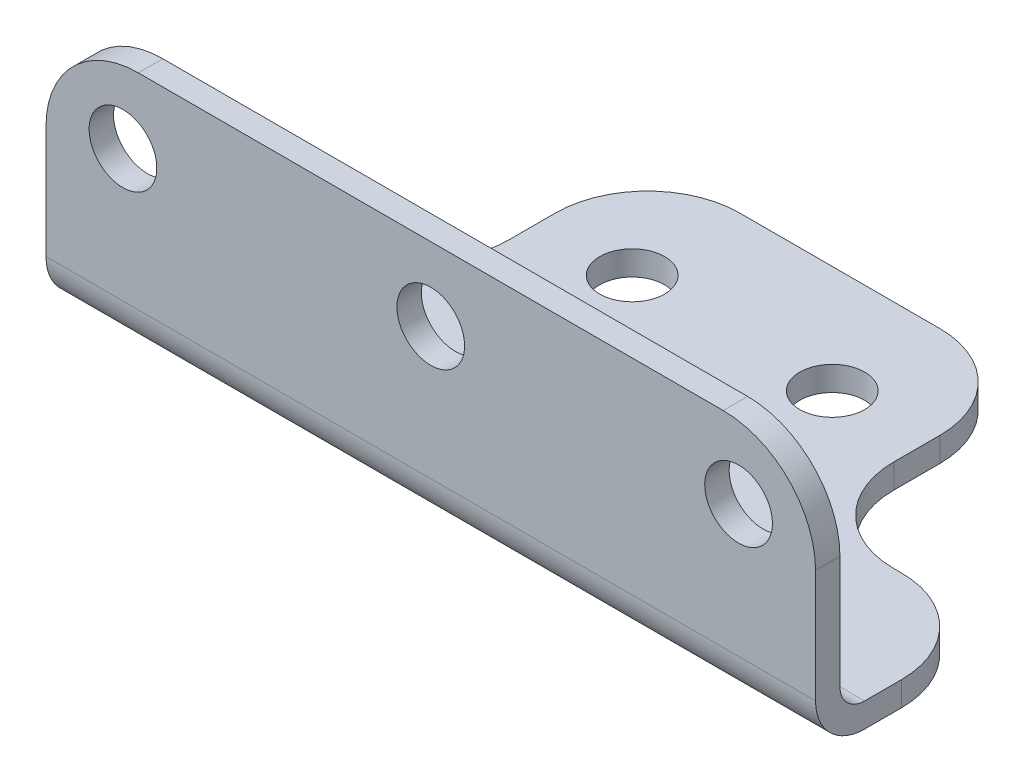
ISO-10303-21;
HEADER;
FILE_DESCRIPTION(('STEP AP214'),'2;1');
FILE_NAME('part.step','',(''),(''),'','','');
FILE_SCHEMA(('AUTOMOTIVE_DESIGN { 1 0 10303 214 1 1 1 1 }'));
ENDSEC;
DATA;
#1=APPLICATION_CONTEXT('core data for automotive mechanical design processes');
#2=APPLICATION_PROTOCOL_DEFINITION('international standard','automotive_design',2000,#1);
#3=PRODUCT_CONTEXT('',#1,'mechanical');
#4=PRODUCT('Part','Part','',(#3));
#5=PRODUCT_RELATED_PRODUCT_CATEGORY('part','',(#4));
#6=PRODUCT_DEFINITION_FORMATION('','',#4);
#7=PRODUCT_DEFINITION_CONTEXT('part definition',#1,'design');
#8=PRODUCT_DEFINITION('design','',#6,#7);
#9=PRODUCT_DEFINITION_SHAPE('','',#8);
#10=(LENGTH_UNIT() NAMED_UNIT(*) SI_UNIT(.MILLI.,.METRE.));
#11=(NAMED_UNIT(*) PLANE_ANGLE_UNIT() SI_UNIT($,.RADIAN.));
#12=(NAMED_UNIT(*) SI_UNIT($,.STERADIAN.) SOLID_ANGLE_UNIT());
#13=UNCERTAINTY_MEASURE_WITH_UNIT(LENGTH_MEASURE(1.E-05),#10,'distance_accuracy_value','');
#14=(GEOMETRIC_REPRESENTATION_CONTEXT(3) GLOBAL_UNCERTAINTY_ASSIGNED_CONTEXT((#13)) GLOBAL_UNIT_ASSIGNED_CONTEXT((#10,
#11,#12)) REPRESENTATION_CONTEXT('',''));
#15=CARTESIAN_POINT('',(0.,0.,0.));
#16=DIRECTION('',(0.,0.,1.));
#17=DIRECTION('',(1.,0.,0.));
#18=AXIS2_PLACEMENT_3D('',#15,#16,#17);
#19=CARTESIAN_POINT('',(456.510652388511,386.148427831157,-513.95));
#20=DIRECTION('',(0.,0.,-1.));
#21=DIRECTION('',(-1.,0.,0.));
#22=AXIS2_PLACEMENT_3D('',#19,#20,#21);
#23=CYLINDRICAL_SURFACE('',#22,2.19999999999999);
#24=CARTESIAN_POINT('',(456.510652388511,386.148427831157,-515.5375));
#25=DIRECTION('',(0.,0.,-1.));
#26=DIRECTION('',(-1.,0.,0.));
#27=AXIS2_PLACEMENT_3D('',#24,#25,#26);
#28=CIRCLE('',#27,2.19999999999999);
#29=CARTESIAN_POINT('',(454.310652388511,386.148427831157,-515.5375));
#30=VERTEX_POINT('',#29);
#31=EDGE_CURVE('E286',#30,#30,#28,.F.);
#32=ORIENTED_EDGE('',*,*,#31,.F.);
#33=EDGE_LOOP('',(#32));
#34=FACE_BOUND('',#33,.T.);
#35=CARTESIAN_POINT('',(456.510652388511,386.148427831157,-513.95));
#36=DIRECTION('',(0.,0.,-1.));
#37=DIRECTION('',(-1.,0.,0.));
#38=AXIS2_PLACEMENT_3D('',#35,#36,#37);
#39=CIRCLE('',#38,2.19999999999999);
#40=CARTESIAN_POINT('',(454.310652388511,386.148427831157,-513.95));
#41=VERTEX_POINT('',#40);
#42=EDGE_CURVE('E19',#41,#41,#39,.F.);
#43=ORIENTED_EDGE('',*,*,#42,.T.);
#44=EDGE_LOOP('',(#43));
#45=FACE_BOUND('',#44,.T.);
#46=ADVANCED_FACE('F16',(#34,#45),#23,.F.);
#47=CARTESIAN_POINT('',(476.510652388511,386.148427831157,-513.95));
#48=DIRECTION('',(0.,0.,-1.));
#49=DIRECTION('',(-1.,0.,0.));
#50=AXIS2_PLACEMENT_3D('',#47,#48,#49);
#51=CYLINDRICAL_SURFACE('',#50,2.20000000000001);
#52=CARTESIAN_POINT('',(476.510652388511,386.148427831157,-515.5375));
#53=DIRECTION('',(0.,0.,-1.));
#54=DIRECTION('',(-1.,0.,0.));
#55=AXIS2_PLACEMENT_3D('',#52,#53,#54);
#56=CIRCLE('',#55,2.20000000000001);
#57=CARTESIAN_POINT('',(474.310652388511,386.148427831157,-515.5375));
#58=VERTEX_POINT('',#57);
#59=EDGE_CURVE('E386',#58,#58,#56,.F.);
#60=ORIENTED_EDGE('',*,*,#59,.F.);
#61=EDGE_LOOP('',(#60));
#62=FACE_BOUND('',#61,.T.);
#63=CARTESIAN_POINT('',(476.510652388511,386.148427831157,-513.95));
#64=DIRECTION('',(0.,0.,-1.));
#65=DIRECTION('',(-1.,0.,0.));
#66=AXIS2_PLACEMENT_3D('',#63,#64,#65);
#67=CIRCLE('',#66,2.20000000000001);
#68=CARTESIAN_POINT('',(474.310652388511,386.148427831157,-513.95));
#69=VERTEX_POINT('',#68);
#70=EDGE_CURVE('E398',#69,#69,#67,.F.);
#71=ORIENTED_EDGE('',*,*,#70,.T.);
#72=EDGE_LOOP('',(#71));
#73=FACE_BOUND('',#72,.T.);
#74=ADVANCED_FACE('F515',(#62,#73),#51,.F.);
#75=CARTESIAN_POINT('',(496.510652388511,386.148427831157,-513.95));
#76=DIRECTION('',(0.,0.,-1.));
#77=DIRECTION('',(-1.,0.,0.));
#78=AXIS2_PLACEMENT_3D('',#75,#76,#77);
#79=CYLINDRICAL_SURFACE('',#78,2.2);
#80=CARTESIAN_POINT('',(496.510652388511,386.148427831157,-515.5375));
#81=DIRECTION('',(0.,0.,-1.));
#82=DIRECTION('',(-1.,0.,0.));
#83=AXIS2_PLACEMENT_3D('',#80,#81,#82);
#84=CIRCLE('',#83,2.2);
#85=CARTESIAN_POINT('',(494.310652388511,386.148427831157,-515.5375));
#86=VERTEX_POINT('',#85);
#87=EDGE_CURVE('E279',#86,#86,#84,.F.);
#88=ORIENTED_EDGE('',*,*,#87,.F.);
#89=EDGE_LOOP('',(#88));
#90=FACE_BOUND('',#89,.T.);
#91=CARTESIAN_POINT('',(496.510652388511,386.148427831157,-513.95));
#92=DIRECTION('',(0.,0.,-1.));
#93=DIRECTION('',(-1.,0.,0.));
#94=AXIS2_PLACEMENT_3D('',#91,#92,#93);
#95=CIRCLE('',#94,2.2);
#96=CARTESIAN_POINT('',(494.310652388511,386.148427831157,-513.95));
#97=VERTEX_POINT('',#96);
#98=EDGE_CURVE('E177',#97,#97,#95,.F.);
#99=ORIENTED_EDGE('',*,*,#98,.T.);
#100=EDGE_LOOP('',(#99));
#101=FACE_BOUND('',#100,.T.);
#102=ADVANCED_FACE('F512',(#90,#101),#79,.F.);
#103=CARTESIAN_POINT('',(501.510652388511,390.910927831157,-513.95));
#104=DIRECTION('',(0.,1.,0.));
#105=DIRECTION('',(0.,0.,1.));
#106=AXIS2_PLACEMENT_3D('',#103,#104,#105);
#107=PLANE('',#106);
#108=DIRECTION('',(0.,0.,-1.));
#109=VECTOR('',#108,1.);
#110=CARTESIAN_POINT('',(495.510652388511,390.910927831157,-513.95));
#111=LINE('',#110,#109);
#112=CARTESIAN_POINT('',(495.510652388511,390.910927831157,-515.5375));
#113=VERTEX_POINT('',#112);
#114=CARTESIAN_POINT('',(495.510652388511,390.910927831157,-513.95));
#115=VERTEX_POINT('',#114);
#116=EDGE_CURVE('E312',#113,#115,#111,.F.);
#117=ORIENTED_EDGE('',*,*,#116,.F.);
#118=DIRECTION('',(-1.,0.,0.));
#119=VECTOR('',#118,1.);
#120=CARTESIAN_POINT('',(444.224335494459,390.910927831157,-515.5375));
#121=LINE('',#120,#119);
#122=CARTESIAN_POINT('',(457.510652388512,390.910927831157,-515.5375));
#123=VERTEX_POINT('',#122);
#124=EDGE_CURVE('E274',#123,#113,#121,.F.);
#125=ORIENTED_EDGE('',*,*,#124,.F.);
#126=DIRECTION('',(0.,0.,1.));
#127=VECTOR('',#126,1.);
#128=CARTESIAN_POINT('',(457.510652388512,390.910927831157,-513.95));
#129=LINE('',#128,#127);
#130=CARTESIAN_POINT('',(457.510652388512,390.910927831157,-513.95));
#131=VERTEX_POINT('',#130);
#132=EDGE_CURVE('E165',#131,#123,#129,.F.);
#133=ORIENTED_EDGE('',*,*,#132,.F.);
#134=DIRECTION('',(-1.,0.,0.));
#135=VECTOR('',#134,1.);
#136=CARTESIAN_POINT('',(444.224335494459,390.910927831157,-513.95));
#137=LINE('',#136,#135);
#138=EDGE_CURVE('E175',#131,#115,#137,.F.);
#139=ORIENTED_EDGE('',*,*,#138,.T.);
#140=EDGE_LOOP('',(#117,#125,#133,#139));
#141=FACE_BOUND('',#140,.T.);
#142=ADVANCED_FACE('F508',(#141),#107,.T.);
#143=CARTESIAN_POINT('',(495.510652388511,384.910927831157,-513.95));
#144=DIRECTION('',(0.,0.,-1.));
#145=DIRECTION('',(-1.,0.,0.));
#146=AXIS2_PLACEMENT_3D('',#143,#144,#145);
#147=CYLINDRICAL_SURFACE('',#146,6.);
#148=DIRECTION('',(0.,0.,-1.));
#149=VECTOR('',#148,1.);
#150=CARTESIAN_POINT('',(501.510652388511,384.910927831157,-513.95));
#151=LINE('',#150,#149);
#152=CARTESIAN_POINT('',(501.510652388511,384.910927831157,-513.95));
#153=VERTEX_POINT('',#152);
#154=CARTESIAN_POINT('',(501.510652388511,384.910927831157,-515.5375));
#155=VERTEX_POINT('',#154);
#156=EDGE_CURVE('E308',#153,#155,#151,.T.);
#157=ORIENTED_EDGE('',*,*,#156,.T.);
#158=CARTESIAN_POINT('',(495.510652388511,384.910927831157,-515.5375));
#159=DIRECTION('',(0.,0.,-1.));
#160=DIRECTION('',(-1.,0.,0.));
#161=AXIS2_PLACEMENT_3D('',#158,#159,#160);
#162=CIRCLE('',#161,6.);
#163=EDGE_CURVE('E278',#113,#155,#162,.T.);
#164=ORIENTED_EDGE('',*,*,#163,.F.);
#165=ORIENTED_EDGE('',*,*,#116,.T.);
#166=CARTESIAN_POINT('',(495.510652388511,384.910927831157,-513.95));
#167=DIRECTION('',(0.,0.,-1.));
#168=DIRECTION('',(-1.,0.,0.));
#169=AXIS2_PLACEMENT_3D('',#166,#167,#168);
#170=CIRCLE('',#169,6.);
#171=EDGE_CURVE('E282',#115,#153,#170,.T.);
#172=ORIENTED_EDGE('',*,*,#171,.T.);
#173=EDGE_LOOP('',(#157,#164,#165,#172));
#174=FACE_BOUND('',#173,.T.);
#175=ADVANCED_FACE('F505',(#174),#147,.T.);
#176=CARTESIAN_POINT('',(457.510652388512,384.910927831157,-513.95));
#177=DIRECTION('',(0.,0.,1.));
#178=DIRECTION('',(1.,0.,0.));
#179=AXIS2_PLACEMENT_3D('',#176,#177,#178);
#180=CYLINDRICAL_SURFACE('',#179,6.);
#181=DIRECTION('',(0.,0.,1.));
#182=VECTOR('',#181,1.);
#183=CARTESIAN_POINT('',(451.510652388512,384.910927831157,-513.95));
#184=LINE('',#183,#182);
#185=CARTESIAN_POINT('',(451.510652388512,384.910927831157,-515.5375));
#186=VERTEX_POINT('',#185);
#187=CARTESIAN_POINT('',(451.510652388512,384.910927831157,-513.95));
#188=VERTEX_POINT('',#187);
#189=EDGE_CURVE('E151',#186,#188,#184,.T.);
#190=ORIENTED_EDGE('',*,*,#189,.T.);
#191=CARTESIAN_POINT('',(457.510652388512,384.910927831157,-513.95));
#192=DIRECTION('',(0.,0.,1.));
#193=DIRECTION('',(1.,0.,0.));
#194=AXIS2_PLACEMENT_3D('',#191,#192,#193);
#195=CIRCLE('',#194,6.);
#196=EDGE_CURVE('E155',#188,#131,#195,.F.);
#197=ORIENTED_EDGE('',*,*,#196,.T.);
#198=ORIENTED_EDGE('',*,*,#132,.T.);
#199=CARTESIAN_POINT('',(457.510652388512,384.910927831157,-515.5375));
#200=DIRECTION('',(0.,0.,1.));
#201=DIRECTION('',(1.,0.,0.));
#202=AXIS2_PLACEMENT_3D('',#199,#200,#201);
#203=CIRCLE('',#202,6.);
#204=EDGE_CURVE('E158',#186,#123,#203,.F.);
#205=ORIENTED_EDGE('',*,*,#204,.F.);
#206=EDGE_LOOP('',(#190,#197,#198,#205));
#207=FACE_BOUND('',#206,.T.);
#208=ADVANCED_FACE('F153',(#207),#180,.T.);
#209=CARTESIAN_POINT('',(489.010652388511,392.563388714083,-525.5375));
#210=DIRECTION('',(0.,0.,1.));
#211=DIRECTION('',(1.,0.,0.));
#212=AXIS2_PLACEMENT_3D('',#209,#210,#211);
#213=PLANE('',#212);
#214=DIRECTION('',(1.,0.,0.));
#215=VECTOR('',#214,1.);
#216=CARTESIAN_POINT('',(489.010652388511,375.973843001901,-525.5375));
#217=LINE('',#216,#215);
#218=CARTESIAN_POINT('',(495.510652388511,375.973843001901,-525.5375));
#219=VERTEX_POINT('',#218);
#220=CARTESIAN_POINT('',(495.010652388511,375.973843001901,-525.5375));
#221=VERTEX_POINT('',#220);
#222=EDGE_CURVE('E164',#219,#221,#217,.F.);
#223=ORIENTED_EDGE('',*,*,#222,.F.);
#224=DIRECTION('',(0.,1.,0.));
#225=VECTOR('',#224,1.);
#226=CARTESIAN_POINT('',(495.510652388511,112.710927831157,-525.5375));
#227=LINE('',#226,#225);
#228=CARTESIAN_POINT('',(495.510652388511,374.386343001901,-525.5375));
#229=VERTEX_POINT('',#228);
#230=EDGE_CURVE('E249',#229,#219,#227,.T.);
#231=ORIENTED_EDGE('',*,*,#230,.F.);
#232=DIRECTION('',(1.,0.,0.));
#233=VECTOR('',#232,1.);
#234=CARTESIAN_POINT('',(444.224335494459,374.386343001901,-525.5375));
#235=LINE('',#234,#233);
#236=CARTESIAN_POINT('',(495.010652388511,374.386343001901,-525.5375));
#237=VERTEX_POINT('',#236);
#238=EDGE_CURVE('E290',#229,#237,#235,.F.);
#239=ORIENTED_EDGE('',*,*,#238,.T.);
#240=DIRECTION('',(0.,-1.,0.));
#241=VECTOR('',#240,1.);
#242=CARTESIAN_POINT('',(495.010652388511,112.710927831157,-525.5375));
#243=LINE('',#242,#241);
#244=EDGE_CURVE('E244',#237,#221,#243,.F.);
#245=ORIENTED_EDGE('',*,*,#244,.T.);
#246=EDGE_LOOP('',(#223,#231,#239,#245));
#247=FACE_BOUND('',#246,.T.);
#248=ADVANCED_FACE('F496',(#247),#213,.F.);
#249=CARTESIAN_POINT('',(444.782168505723,392.563388714083,-525.5375));
#250=DIRECTION('',(0.,0.,1.));
#251=DIRECTION('',(1.,0.,0.));
#252=AXIS2_PLACEMENT_3D('',#249,#250,#251);
#253=PLANE('',#252);
#254=DIRECTION('',(1.,0.,0.));
#255=VECTOR('',#254,1.);
#256=CARTESIAN_POINT('',(444.224335494459,374.386343001901,-525.5375));
#257=LINE('',#256,#255);
#258=CARTESIAN_POINT('',(458.010652388511,374.386343001901,-525.5375));
#259=VERTEX_POINT('',#258);
#260=CARTESIAN_POINT('',(457.510652388512,374.386343001901,-525.5375));
#261=VERTEX_POINT('',#260);
#262=EDGE_CURVE('E293',#259,#261,#257,.F.);
#263=ORIENTED_EDGE('',*,*,#262,.T.);
#264=DIRECTION('',(0.,-1.,0.));
#265=VECTOR('',#264,1.);
#266=CARTESIAN_POINT('',(457.510652388512,112.710927831157,-525.5375));
#267=LINE('',#266,#265);
#268=CARTESIAN_POINT('',(457.510652388512,375.973843001901,-525.5375));
#269=VERTEX_POINT('',#268);
#270=EDGE_CURVE('E209',#269,#261,#267,.T.);
#271=ORIENTED_EDGE('',*,*,#270,.F.);
#272=DIRECTION('',(1.,0.,0.));
#273=VECTOR('',#272,1.);
#274=CARTESIAN_POINT('',(444.782168505723,375.973843001901,-525.5375));
#275=LINE('',#274,#273);
#276=CARTESIAN_POINT('',(458.010652388511,375.973843001901,-525.5375));
#277=VERTEX_POINT('',#276);
#278=EDGE_CURVE('E296',#277,#269,#275,.F.);
#279=ORIENTED_EDGE('',*,*,#278,.F.);
#280=DIRECTION('',(0.,1.,0.));
#281=VECTOR('',#280,1.);
#282=CARTESIAN_POINT('',(458.010652388511,112.710927831157,-525.5375));
#283=LINE('',#282,#281);
#284=EDGE_CURVE('E213',#277,#259,#283,.F.);
#285=ORIENTED_EDGE('',*,*,#284,.T.);
#286=EDGE_LOOP('',(#263,#271,#279,#285));
#287=FACE_BOUND('',#286,.T.);
#288=ADVANCED_FACE('F488',(#287),#253,.F.);
#289=CARTESIAN_POINT('',(444.224335494459,374.386343001901,-778.674584829256));
#290=DIRECTION('',(0.,1.,0.));
#291=DIRECTION('',(0.,0.,1.));
#292=AXIS2_PLACEMENT_3D('',#289,#290,#291);
#293=PLANE('',#292);
#294=CARTESIAN_POINT('',(495.010652388511,374.386343001901,-531.5375));
#295=DIRECTION('',(0.,-1.,0.));
#296=DIRECTION('',(0.,0.,-1.));
#297=AXIS2_PLACEMENT_3D('',#294,#295,#296);
#298=CIRCLE('',#297,6.);
#299=CARTESIAN_POINT('',(489.010652388511,374.386343001901,-531.5375));
#300=VERTEX_POINT('',#299);
#301=EDGE_CURVE('E248',#300,#237,#298,.F.);
#302=ORIENTED_EDGE('',*,*,#301,.T.);
#303=ORIENTED_EDGE('',*,*,#238,.F.);
#304=CARTESIAN_POINT('',(495.510652388511,374.386343001901,-519.5375));
#305=DIRECTION('',(0.,1.,0.));
#306=DIRECTION('',(0.,0.,1.));
#307=AXIS2_PLACEMENT_3D('',#304,#305,#306);
#308=CIRCLE('',#307,6.);
#309=CARTESIAN_POINT('',(501.510652388511,374.386343001901,-519.5375));
#310=VERTEX_POINT('',#309);
#311=EDGE_CURVE('E257',#310,#229,#308,.T.);
#312=ORIENTED_EDGE('',*,*,#311,.F.);
#313=DIRECTION('',(0.,0.,-1.));
#314=VECTOR('',#313,1.);
#315=CARTESIAN_POINT('',(501.510652388511,374.386343001901,-513.95));
#316=LINE('',#315,#314);
#317=CARTESIAN_POINT('',(501.510652388511,374.386343001901,-517.1375));
#318=VERTEX_POINT('',#317);
#319=EDGE_CURVE('E254',#318,#310,#316,.T.);
#320=ORIENTED_EDGE('',*,*,#319,.F.);
#321=DIRECTION('',(-1.,0.,0.));
#322=VECTOR('',#321,1.);
#323=CARTESIAN_POINT('',(451.510652388512,374.386343001901,-517.1375));
#324=LINE('',#323,#322);
#325=CARTESIAN_POINT('',(451.510652388512,374.386343001901,-517.1375));
#326=VERTEX_POINT('',#325);
#327=EDGE_CURVE('E287',#326,#318,#324,.F.);
#328=ORIENTED_EDGE('',*,*,#327,.F.);
#329=DIRECTION('',(0.,0.,1.));
#330=VECTOR('',#329,1.);
#331=CARTESIAN_POINT('',(451.510652388512,374.386343001901,-500.474584829256));
#332=LINE('',#331,#330);
#333=CARTESIAN_POINT('',(451.510652388512,374.386343001901,-519.5375));
#334=VERTEX_POINT('',#333);
#335=EDGE_CURVE('E194',#334,#326,#332,.T.);
#336=ORIENTED_EDGE('',*,*,#335,.F.);
#337=CARTESIAN_POINT('',(457.510652388512,374.386343001901,-519.5375));
#338=DIRECTION('',(0.,-1.,0.));
#339=DIRECTION('',(0.,0.,-1.));
#340=AXIS2_PLACEMENT_3D('',#337,#338,#339);
#341=CIRCLE('',#340,6.);
#342=EDGE_CURVE('E202',#261,#334,#341,.F.);
#343=ORIENTED_EDGE('',*,*,#342,.F.);
#344=ORIENTED_EDGE('',*,*,#262,.F.);
#345=CARTESIAN_POINT('',(458.010652388511,374.386343001901,-531.5375));
#346=DIRECTION('',(0.,1.,0.));
#347=DIRECTION('',(0.,0.,1.));
#348=AXIS2_PLACEMENT_3D('',#345,#346,#347);
#349=CIRCLE('',#348,6.);
#350=CARTESIAN_POINT('',(464.010652388511,374.386343001901,-531.5375));
#351=VERTEX_POINT('',#350);
#352=EDGE_CURVE('E217',#259,#351,#349,.T.);
#353=ORIENTED_EDGE('',*,*,#352,.T.);
#354=DIRECTION('',(0.,0.,-1.));
#355=VECTOR('',#354,1.);
#356=CARTESIAN_POINT('',(464.010652388511,374.386343001901,-525.5375));
#357=LINE('',#356,#355);
#358=CARTESIAN_POINT('',(464.010652388511,374.386343001901,-534.5375));
#359=VERTEX_POINT('',#358);
#360=EDGE_CURVE('E224',#351,#359,#357,.T.);
#361=ORIENTED_EDGE('',*,*,#360,.T.);
#362=CARTESIAN_POINT('',(470.010652388511,374.386343001901,-534.5375));
#363=DIRECTION('',(0.,1.,0.));
#364=DIRECTION('',(0.,0.,1.));
#365=AXIS2_PLACEMENT_3D('',#362,#363,#364);
#366=CIRCLE('',#365,6.);
#367=CARTESIAN_POINT('',(470.010652388511,374.386343001901,-540.5375));
#368=VERTEX_POINT('',#367);
#369=EDGE_CURVE('E229',#368,#359,#366,.T.);
#370=ORIENTED_EDGE('',*,*,#369,.F.);
#371=DIRECTION('',(-1.,0.,0.));
#372=VECTOR('',#371,1.);
#373=CARTESIAN_POINT('',(444.224335494459,374.386343001901,-540.5375));
#374=LINE('',#373,#372);
#375=CARTESIAN_POINT('',(483.010652388511,374.386343001901,-540.5375));
#376=VERTEX_POINT('',#375);
#377=EDGE_CURVE('E230',#376,#368,#374,.T.);
#378=ORIENTED_EDGE('',*,*,#377,.F.);
#379=CARTESIAN_POINT('',(483.010652388511,374.386343001901,-534.5375));
#380=DIRECTION('',(0.,-1.,0.));
#381=DIRECTION('',(0.,0.,-1.));
#382=AXIS2_PLACEMENT_3D('',#379,#380,#381);
#383=CIRCLE('',#382,6.);
#384=CARTESIAN_POINT('',(489.010652388511,374.386343001901,-534.5375));
#385=VERTEX_POINT('',#384);
#386=EDGE_CURVE('E235',#385,#376,#383,.F.);
#387=ORIENTED_EDGE('',*,*,#386,.F.);
#388=DIRECTION('',(0.,0.,1.));
#389=VECTOR('',#388,1.);
#390=CARTESIAN_POINT('',(489.010652388511,374.386343001901,-540.792616769076));
#391=LINE('',#390,#389);
#392=EDGE_CURVE('E243',#385,#300,#391,.T.);
#393=ORIENTED_EDGE('',*,*,#392,.T.);
#394=EDGE_LOOP('',(#302,#303,#312,#320,#328,#336,#343,#344,#353,#361,#370,#378,#387,#393));
#395=FACE_BOUND('',#394,.T.);
#396=CARTESIAN_POINT('',(483.010652388511,374.386343001901,-533.5375));
#397=DIRECTION('',(0.,-1.,0.));
#398=DIRECTION('',(0.,0.,-1.));
#399=AXIS2_PLACEMENT_3D('',#396,#397,#398);
#400=CIRCLE('',#399,2.11);
#401=CARTESIAN_POINT('',(483.010652388511,374.386343001901,-535.6475));
#402=VERTEX_POINT('',#401);
#403=EDGE_CURVE('E375',#402,#402,#400,.F.);
#404=ORIENTED_EDGE('',*,*,#403,.T.);
#405=EDGE_LOOP('',(#404));
#406=FACE_BOUND('',#405,.T.);
#407=CARTESIAN_POINT('',(470.010652388511,374.386343001901,-533.5375));
#408=DIRECTION('',(0.,-1.,0.));
#409=DIRECTION('',(0.,0.,-1.));
#410=AXIS2_PLACEMENT_3D('',#407,#408,#409);
#411=CIRCLE('',#410,2.11);
#412=CARTESIAN_POINT('',(470.010652388511,374.386343001901,-535.6475));
#413=VERTEX_POINT('',#412);
#414=EDGE_CURVE('E273',#413,#413,#411,.F.);
#415=ORIENTED_EDGE('',*,*,#414,.T.);
#416=EDGE_LOOP('',(#415));
#417=FACE_BOUND('',#416,.T.);
#418=ADVANCED_FACE('F419',(#395,#406,#417),#293,.F.);
#419=CARTESIAN_POINT('',(451.510652388512,377.573843001901,-517.1375));
#420=DIRECTION('',(-1.,0.,0.));
#421=DIRECTION('',(0.,0.,1.));
#422=AXIS2_PLACEMENT_3D('',#419,#420,#421);
#423=CYLINDRICAL_SURFACE('',#422,3.1875);
#424=DIRECTION('',(-1.,0.,0.));
#425=VECTOR('',#424,1.);
#426=CARTESIAN_POINT('',(444.224335494459,377.573843001901,-513.95));
#427=LINE('',#426,#425);
#428=CARTESIAN_POINT('',(501.510652388511,377.573843001901,-513.95));
#429=VERTEX_POINT('',#428);
#430=CARTESIAN_POINT('',(451.510652388512,377.573843001901,-513.95));
#431=VERTEX_POINT('',#430);
#432=EDGE_CURVE('E283',#429,#431,#427,.T.);
#433=ORIENTED_EDGE('',*,*,#432,.T.);
#434=CARTESIAN_POINT('',(451.510652388512,377.573843001901,-517.1375));
#435=DIRECTION('',(-1.,0.,0.));
#436=DIRECTION('',(0.,0.,1.));
#437=AXIS2_PLACEMENT_3D('',#434,#435,#436);
#438=CIRCLE('',#437,3.1875);
#439=EDGE_CURVE('E183',#326,#431,#438,.T.);
#440=ORIENTED_EDGE('',*,*,#439,.F.);
#441=ORIENTED_EDGE('',*,*,#327,.T.);
#442=CARTESIAN_POINT('',(501.510652388511,377.573843001901,-517.1375));
#443=DIRECTION('',(-1.,0.,0.));
#444=DIRECTION('',(0.,0.,1.));
#445=AXIS2_PLACEMENT_3D('',#442,#443,#444);
#446=CIRCLE('',#445,3.1875);
#447=EDGE_CURVE('E260',#429,#318,#446,.F.);
#448=ORIENTED_EDGE('',*,*,#447,.F.);
#449=EDGE_LOOP('',(#433,#440,#441,#448));
#450=FACE_BOUND('',#449,.T.);
#451=ADVANCED_FACE('F410',(#450),#423,.T.);
#452=CARTESIAN_POINT('',(444.224335494459,112.710927831157,-513.95));
#453=DIRECTION('',(0.,0.,-1.));
#454=DIRECTION('',(-1.,0.,0.));
#455=AXIS2_PLACEMENT_3D('',#452,#453,#454);
#456=PLANE('',#455);
#457=DIRECTION('',(0.,1.,0.));
#458=VECTOR('',#457,1.);
#459=CARTESIAN_POINT('',(501.510652388511,315.910927831157,-513.95));
#460=LINE('',#459,#458);
#461=EDGE_CURVE('E261',#153,#429,#460,.F.);
#462=ORIENTED_EDGE('',*,*,#461,.F.);
#463=ORIENTED_EDGE('',*,*,#171,.F.);
#464=ORIENTED_EDGE('',*,*,#138,.F.);
#465=ORIENTED_EDGE('',*,*,#196,.F.);
#466=DIRECTION('',(0.,1.,0.));
#467=VECTOR('',#466,1.);
#468=CARTESIAN_POINT('',(451.510652388512,374.386343001901,-513.95));
#469=LINE('',#468,#467);
#470=EDGE_CURVE('E172',#431,#188,#469,.T.);
#471=ORIENTED_EDGE('',*,*,#470,.F.);
#472=ORIENTED_EDGE('',*,*,#432,.F.);
#473=EDGE_LOOP('',(#462,#463,#464,#465,#471,#472));
#474=FACE_BOUND('',#473,.T.);
#475=ORIENTED_EDGE('',*,*,#98,.F.);
#476=EDGE_LOOP('',(#475));
#477=FACE_BOUND('',#476,.T.);
#478=ORIENTED_EDGE('',*,*,#70,.F.);
#479=EDGE_LOOP('',(#478));
#480=FACE_BOUND('',#479,.T.);
#481=ORIENTED_EDGE('',*,*,#42,.F.);
#482=EDGE_LOOP('',(#481));
#483=FACE_BOUND('',#482,.T.);
#484=ADVANCED_FACE('F170',(#474,#477,#480,#483),#456,.F.);
#485=CARTESIAN_POINT('',(444.224335494459,112.710927831157,-515.5375));
#486=DIRECTION('',(0.,0.,-1.));
#487=DIRECTION('',(-1.,0.,0.));
#488=AXIS2_PLACEMENT_3D('',#485,#486,#487);
#489=PLANE('',#488);
#490=DIRECTION('',(0.,1.,0.));
#491=VECTOR('',#490,1.);
#492=CARTESIAN_POINT('',(451.510652388512,374.386343001901,-515.5375));
#493=LINE('',#492,#491);
#494=CARTESIAN_POINT('',(451.510652388512,377.573843001901,-515.5375));
#495=VERTEX_POINT('',#494);
#496=EDGE_CURVE('E185',#186,#495,#493,.F.);
#497=ORIENTED_EDGE('',*,*,#496,.F.);
#498=ORIENTED_EDGE('',*,*,#204,.T.);
#499=ORIENTED_EDGE('',*,*,#124,.T.);
#500=ORIENTED_EDGE('',*,*,#163,.T.);
#501=DIRECTION('',(0.,1.,0.));
#502=VECTOR('',#501,1.);
#503=CARTESIAN_POINT('',(501.510652388511,315.910927831157,-515.5375));
#504=LINE('',#503,#502);
#505=CARTESIAN_POINT('',(501.510652388511,377.573843001901,-515.5375));
#506=VERTEX_POINT('',#505);
#507=EDGE_CURVE('E265',#506,#155,#504,.T.);
#508=ORIENTED_EDGE('',*,*,#507,.F.);
#509=DIRECTION('',(-1.,0.,0.));
#510=VECTOR('',#509,1.);
#511=CARTESIAN_POINT('',(451.510652388512,377.573843001901,-515.5375));
#512=LINE('',#511,#510);
#513=EDGE_CURVE('E270',#506,#495,#512,.T.);
#514=ORIENTED_EDGE('',*,*,#513,.T.);
#515=EDGE_LOOP('',(#497,#498,#499,#500,#508,#514));
#516=FACE_BOUND('',#515,.T.);
#517=ORIENTED_EDGE('',*,*,#87,.T.);
#518=EDGE_LOOP('',(#517));
#519=FACE_BOUND('',#518,.T.);
#520=ORIENTED_EDGE('',*,*,#59,.T.);
#521=EDGE_LOOP('',(#520));
#522=FACE_BOUND('',#521,.T.);
#523=ORIENTED_EDGE('',*,*,#31,.T.);
#524=EDGE_LOOP('',(#523));
#525=FACE_BOUND('',#524,.T.);
#526=ADVANCED_FACE('F409',(#516,#519,#522,#525),#489,.T.);
#527=CARTESIAN_POINT('',(483.010652388511,392.563388714083,-533.5375));
#528=DIRECTION('',(0.,-1.,0.));
#529=DIRECTION('',(0.,0.,-1.));
#530=AXIS2_PLACEMENT_3D('',#527,#528,#529);
#531=CYLINDRICAL_SURFACE('',#530,2.11);
#532=ORIENTED_EDGE('',*,*,#403,.F.);
#533=EDGE_LOOP('',(#532));
#534=FACE_BOUND('',#533,.T.);
#535=CARTESIAN_POINT('',(483.010652388511,375.973843001901,-533.5375));
#536=DIRECTION('',(0.,-1.,0.));
#537=DIRECTION('',(0.,0.,-1.));
#538=AXIS2_PLACEMENT_3D('',#535,#536,#537);
#539=CIRCLE('',#538,2.11);
#540=CARTESIAN_POINT('',(483.010652388511,375.973843001901,-535.6475));
#541=VERTEX_POINT('',#540);
#542=EDGE_CURVE('E345',#541,#541,#539,.T.);
#543=ORIENTED_EDGE('',*,*,#542,.F.);
#544=EDGE_LOOP('',(#543));
#545=FACE_BOUND('',#544,.T.);
#546=ADVANCED_FACE('F416',(#534,#545),#531,.F.);
#547=CARTESIAN_POINT('',(470.010652388511,392.563388714083,-533.5375));
#548=DIRECTION('',(0.,-1.,0.));
#549=DIRECTION('',(0.,0.,-1.));
#550=AXIS2_PLACEMENT_3D('',#547,#548,#549);
#551=CYLINDRICAL_SURFACE('',#550,2.11);
#552=ORIENTED_EDGE('',*,*,#414,.F.);
#553=EDGE_LOOP('',(#552));
#554=FACE_BOUND('',#553,.T.);
#555=CARTESIAN_POINT('',(470.010652388511,375.973843001901,-533.5375));
#556=DIRECTION('',(0.,-1.,0.));
#557=DIRECTION('',(0.,0.,-1.));
#558=AXIS2_PLACEMENT_3D('',#555,#556,#557);
#559=CIRCLE('',#558,2.11);
#560=CARTESIAN_POINT('',(470.010652388511,375.973843001901,-535.6475));
#561=VERTEX_POINT('',#560);
#562=EDGE_CURVE('E208',#561,#561,#559,.T.);
#563=ORIENTED_EDGE('',*,*,#562,.F.);
#564=EDGE_LOOP('',(#563));
#565=FACE_BOUND('',#564,.T.);
#566=ADVANCED_FACE('F473',(#554,#565),#551,.F.);
#567=CARTESIAN_POINT('',(451.510652388512,377.573843001901,-517.1375));
#568=DIRECTION('',(-1.,0.,0.));
#569=DIRECTION('',(0.,0.,1.));
#570=AXIS2_PLACEMENT_3D('',#567,#568,#569);
#571=CYLINDRICAL_SURFACE('',#570,1.6);
#572=CARTESIAN_POINT('',(501.510652388511,377.573843001901,-517.1375));
#573=DIRECTION('',(-1.,0.,0.));
#574=DIRECTION('',(0.,0.,1.));
#575=AXIS2_PLACEMENT_3D('',#572,#573,#574);
#576=CIRCLE('',#575,1.6);
#577=CARTESIAN_POINT('',(501.510652388511,375.973843001901,-517.1375));
#578=VERTEX_POINT('',#577);
#579=EDGE_CURVE('E269',#578,#506,#576,.T.);
#580=ORIENTED_EDGE('',*,*,#579,.F.);
#581=DIRECTION('',(1.,0.,0.));
#582=VECTOR('',#581,1.);
#583=CARTESIAN_POINT('',(444.224335494459,375.973843001901,-517.1375));
#584=LINE('',#583,#582);
#585=CARTESIAN_POINT('',(451.510652388512,375.973843001901,-517.1375));
#586=VERTEX_POINT('',#585);
#587=EDGE_CURVE('E203',#586,#578,#584,.T.);
#588=ORIENTED_EDGE('',*,*,#587,.F.);
#589=CARTESIAN_POINT('',(451.510652388512,377.573843001901,-517.1375));
#590=DIRECTION('',(-1.,0.,0.));
#591=DIRECTION('',(0.,0.,1.));
#592=AXIS2_PLACEMENT_3D('',#589,#590,#591);
#593=CIRCLE('',#592,1.6);
#594=EDGE_CURVE('E191',#495,#586,#593,.F.);
#595=ORIENTED_EDGE('',*,*,#594,.F.);
#596=ORIENTED_EDGE('',*,*,#513,.F.);
#597=EDGE_LOOP('',(#580,#588,#595,#596));
#598=FACE_BOUND('',#597,.T.);
#599=ADVANCED_FACE('F469',(#598),#571,.F.);
#600=CARTESIAN_POINT('',(501.510652388511,315.910927831157,-513.95));
#601=DIRECTION('',(1.,0.,0.));
#602=DIRECTION('',(0.,0.,-1.));
#603=AXIS2_PLACEMENT_3D('',#600,#601,#602);
#604=PLANE('',#603);
#605=ORIENTED_EDGE('',*,*,#447,.T.);
#606=ORIENTED_EDGE('',*,*,#319,.T.);
#607=DIRECTION('',(0.,1.,0.));
#608=VECTOR('',#607,1.);
#609=CARTESIAN_POINT('',(501.510652388511,112.710927831157,-519.5375));
#610=LINE('',#609,#608);
#611=CARTESIAN_POINT('',(501.510652388511,375.973843001901,-519.5375));
#612=VERTEX_POINT('',#611);
#613=EDGE_CURVE('E253',#612,#310,#610,.F.);
#614=ORIENTED_EDGE('',*,*,#613,.F.);
#615=DIRECTION('',(0.,0.,1.));
#616=VECTOR('',#615,1.);
#617=CARTESIAN_POINT('',(501.510652388511,375.973843001901,-778.674584829256));
#618=LINE('',#617,#616);
#619=EDGE_CURVE('E207',#578,#612,#618,.F.);
#620=ORIENTED_EDGE('',*,*,#619,.F.);
#621=ORIENTED_EDGE('',*,*,#579,.T.);
#622=ORIENTED_EDGE('',*,*,#507,.T.);
#623=ORIENTED_EDGE('',*,*,#156,.F.);
#624=ORIENTED_EDGE('',*,*,#461,.T.);
#625=EDGE_LOOP('',(#605,#606,#614,#620,#621,#622,#623,#624));
#626=FACE_BOUND('',#625,.T.);
#627=ADVANCED_FACE('F465',(#626),#604,.T.);
#628=CARTESIAN_POINT('',(495.510652388511,112.710927831157,-519.5375));
#629=DIRECTION('',(0.,1.,0.));
#630=DIRECTION('',(0.,0.,1.));
#631=AXIS2_PLACEMENT_3D('',#628,#629,#630);
#632=CYLINDRICAL_SURFACE('',#631,6.);
#633=ORIENTED_EDGE('',*,*,#613,.T.);
#634=ORIENTED_EDGE('',*,*,#311,.T.);
#635=ORIENTED_EDGE('',*,*,#230,.T.);
#636=CARTESIAN_POINT('',(495.510652388511,375.973843001901,-519.5375));
#637=DIRECTION('',(0.,1.,0.));
#638=DIRECTION('',(0.,0.,1.));
#639=AXIS2_PLACEMENT_3D('',#636,#637,#638);
#640=CIRCLE('',#639,6.);
#641=EDGE_CURVE('E338',#612,#219,#640,.T.);
#642=ORIENTED_EDGE('',*,*,#641,.F.);
#643=EDGE_LOOP('',(#633,#634,#635,#642));
#644=FACE_BOUND('',#643,.T.);
#645=ADVANCED_FACE('F461',(#644),#632,.T.);
#646=CARTESIAN_POINT('',(495.010652388511,112.710927831157,-531.5375));
#647=DIRECTION('',(0.,-1.,0.));
#648=DIRECTION('',(0.,0.,-1.));
#649=AXIS2_PLACEMENT_3D('',#646,#647,#648);
#650=CYLINDRICAL_SURFACE('',#649,6.);
#651=ORIENTED_EDGE('',*,*,#301,.F.);
#652=DIRECTION('',(0.,1.,0.));
#653=VECTOR('',#652,1.);
#654=CARTESIAN_POINT('',(489.010652388511,392.563388714083,-531.5375));
#655=LINE('',#654,#653);
#656=CARTESIAN_POINT('',(489.010652388511,375.973843001901,-531.5375));
#657=VERTEX_POINT('',#656);
#658=EDGE_CURVE('E240',#300,#657,#655,.T.);
#659=ORIENTED_EDGE('',*,*,#658,.T.);
#660=CARTESIAN_POINT('',(495.010652388511,375.973843001901,-531.5375));
#661=DIRECTION('',(0.,-1.,0.));
#662=DIRECTION('',(0.,0.,-1.));
#663=AXIS2_PLACEMENT_3D('',#660,#661,#662);
#664=CIRCLE('',#663,6.);
#665=EDGE_CURVE('E334',#221,#657,#664,.T.);
#666=ORIENTED_EDGE('',*,*,#665,.F.);
#667=ORIENTED_EDGE('',*,*,#244,.F.);
#668=EDGE_LOOP('',(#651,#659,#666,#667));
#669=FACE_BOUND('',#668,.T.);
#670=ADVANCED_FACE('F457',(#669),#650,.F.);
#671=CARTESIAN_POINT('',(489.010652388511,392.563388714083,-540.792616769076));
#672=DIRECTION('',(-1.,0.,0.));
#673=DIRECTION('',(0.,0.,1.));
#674=AXIS2_PLACEMENT_3D('',#671,#672,#673);
#675=PLANE('',#674);
#676=DIRECTION('',(0.,0.,1.));
#677=VECTOR('',#676,1.);
#678=CARTESIAN_POINT('',(489.010652388511,375.973843001901,-778.674584829256));
#679=LINE('',#678,#677);
#680=CARTESIAN_POINT('',(489.010652388511,375.973843001901,-534.5375));
#681=VERTEX_POINT('',#680);
#682=EDGE_CURVE('E333',#657,#681,#679,.F.);
#683=ORIENTED_EDGE('',*,*,#682,.F.);
#684=ORIENTED_EDGE('',*,*,#658,.F.);
#685=ORIENTED_EDGE('',*,*,#392,.F.);
#686=DIRECTION('',(0.,-1.,0.));
#687=VECTOR('',#686,1.);
#688=CARTESIAN_POINT('',(489.010652388511,112.710927831157,-534.5375));
#689=LINE('',#688,#687);
#690=EDGE_CURVE('E236',#681,#385,#689,.T.);
#691=ORIENTED_EDGE('',*,*,#690,.F.);
#692=EDGE_LOOP('',(#683,#684,#685,#691));
#693=FACE_BOUND('',#692,.T.);
#694=ADVANCED_FACE('F453',(#693),#675,.F.);
#695=CARTESIAN_POINT('',(483.010652388511,112.710927831157,-534.5375));
#696=DIRECTION('',(0.,-1.,0.));
#697=DIRECTION('',(0.,0.,-1.));
#698=AXIS2_PLACEMENT_3D('',#695,#696,#697);
#699=CYLINDRICAL_SURFACE('',#698,6.);
#700=DIRECTION('',(0.,1.,0.));
#701=VECTOR('',#700,1.);
#702=CARTESIAN_POINT('',(483.010652388511,112.710927831157,-540.5375));
#703=LINE('',#702,#701);
#704=CARTESIAN_POINT('',(483.010652388511,375.973843001901,-540.5375));
#705=VERTEX_POINT('',#704);
#706=EDGE_CURVE('E231',#705,#376,#703,.F.);
#707=ORIENTED_EDGE('',*,*,#706,.F.);
#708=CARTESIAN_POINT('',(483.010652388511,375.973843001901,-534.5375));
#709=DIRECTION('',(0.,-1.,0.));
#710=DIRECTION('',(0.,0.,-1.));
#711=AXIS2_PLACEMENT_3D('',#708,#709,#710);
#712=CIRCLE('',#711,6.);
#713=EDGE_CURVE('E329',#681,#705,#712,.F.);
#714=ORIENTED_EDGE('',*,*,#713,.F.);
#715=ORIENTED_EDGE('',*,*,#690,.T.);
#716=ORIENTED_EDGE('',*,*,#386,.T.);
#717=EDGE_LOOP('',(#707,#714,#715,#716));
#718=FACE_BOUND('',#717,.T.);
#719=ADVANCED_FACE('F449',(#718),#699,.T.);
#720=CARTESIAN_POINT('',(444.224335494459,112.710927831157,-540.5375));
#721=DIRECTION('',(0.,0.,-1.));
#722=DIRECTION('',(-1.,0.,0.));
#723=AXIS2_PLACEMENT_3D('',#720,#721,#722);
#724=PLANE('',#723);
#725=DIRECTION('',(0.,1.,0.));
#726=VECTOR('',#725,1.);
#727=CARTESIAN_POINT('',(470.010652388511,112.710927831157,-540.5375));
#728=LINE('',#727,#726);
#729=CARTESIAN_POINT('',(470.010652388511,375.973843001901,-540.5375));
#730=VERTEX_POINT('',#729);
#731=EDGE_CURVE('E225',#730,#368,#728,.F.);
#732=ORIENTED_EDGE('',*,*,#731,.F.);
#733=DIRECTION('',(1.,0.,0.));
#734=VECTOR('',#733,1.);
#735=CARTESIAN_POINT('',(444.224335494459,375.973843001901,-540.5375));
#736=LINE('',#735,#734);
#737=EDGE_CURVE('E328',#705,#730,#736,.F.);
#738=ORIENTED_EDGE('',*,*,#737,.F.);
#739=ORIENTED_EDGE('',*,*,#706,.T.);
#740=ORIENTED_EDGE('',*,*,#377,.T.);
#741=EDGE_LOOP('',(#732,#738,#739,#740));
#742=FACE_BOUND('',#741,.T.);
#743=ADVANCED_FACE('F445',(#742),#724,.T.);
#744=CARTESIAN_POINT('',(470.010652388511,112.710927831157,-534.5375));
#745=DIRECTION('',(0.,1.,0.));
#746=DIRECTION('',(0.,0.,1.));
#747=AXIS2_PLACEMENT_3D('',#744,#745,#746);
#748=CYLINDRICAL_SURFACE('',#747,6.);
#749=ORIENTED_EDGE('',*,*,#731,.T.);
#750=ORIENTED_EDGE('',*,*,#369,.T.);
#751=DIRECTION('',(0.,1.,0.));
#752=VECTOR('',#751,1.);
#753=CARTESIAN_POINT('',(464.010652388511,392.563388714083,-534.5375));
#754=LINE('',#753,#752);
#755=CARTESIAN_POINT('',(464.010652388511,375.973843001901,-534.5375));
#756=VERTEX_POINT('',#755);
#757=EDGE_CURVE('E221',#359,#756,#754,.T.);
#758=ORIENTED_EDGE('',*,*,#757,.T.);
#759=CARTESIAN_POINT('',(470.010652388511,375.973843001901,-534.5375));
#760=DIRECTION('',(0.,1.,0.));
#761=DIRECTION('',(0.,0.,1.));
#762=AXIS2_PLACEMENT_3D('',#759,#760,#761);
#763=CIRCLE('',#762,6.);
#764=EDGE_CURVE('E324',#730,#756,#763,.T.);
#765=ORIENTED_EDGE('',*,*,#764,.F.);
#766=EDGE_LOOP('',(#749,#750,#758,#765));
#767=FACE_BOUND('',#766,.T.);
#768=ADVANCED_FACE('F441',(#767),#748,.T.);
#769=CARTESIAN_POINT('',(464.010652388511,392.563388714083,-525.5375));
#770=DIRECTION('',(1.,0.,0.));
#771=DIRECTION('',(0.,0.,-1.));
#772=AXIS2_PLACEMENT_3D('',#769,#770,#771);
#773=PLANE('',#772);
#774=ORIENTED_EDGE('',*,*,#360,.F.);
#775=DIRECTION('',(0.,1.,0.));
#776=VECTOR('',#775,1.);
#777=CARTESIAN_POINT('',(464.010652388511,112.710927831157,-531.5375));
#778=LINE('',#777,#776);
#779=CARTESIAN_POINT('',(464.010652388511,375.973843001901,-531.5375));
#780=VERTEX_POINT('',#779);
#781=EDGE_CURVE('E214',#351,#780,#778,.T.);
#782=ORIENTED_EDGE('',*,*,#781,.T.);
#783=DIRECTION('',(0.,0.,1.));
#784=VECTOR('',#783,1.);
#785=CARTESIAN_POINT('',(464.010652388511,375.973843001901,-778.674584829256));
#786=LINE('',#785,#784);
#787=EDGE_CURVE('E323',#756,#780,#786,.T.);
#788=ORIENTED_EDGE('',*,*,#787,.F.);
#789=ORIENTED_EDGE('',*,*,#757,.F.);
#790=EDGE_LOOP('',(#774,#782,#788,#789));
#791=FACE_BOUND('',#790,.T.);
#792=ADVANCED_FACE('F437',(#791),#773,.F.);
#793=CARTESIAN_POINT('',(458.010652388511,112.710927831157,-531.5375));
#794=DIRECTION('',(0.,1.,0.));
#795=DIRECTION('',(0.,0.,1.));
#796=AXIS2_PLACEMENT_3D('',#793,#794,#795);
#797=CYLINDRICAL_SURFACE('',#796,6.);
#798=CARTESIAN_POINT('',(458.010652388511,375.973843001901,-531.5375));
#799=DIRECTION('',(0.,1.,0.));
#800=DIRECTION('',(0.,0.,1.));
#801=AXIS2_PLACEMENT_3D('',#798,#799,#800);
#802=CIRCLE('',#801,6.);
#803=EDGE_CURVE('E319',#780,#277,#802,.F.);
#804=ORIENTED_EDGE('',*,*,#803,.F.);
#805=ORIENTED_EDGE('',*,*,#781,.F.);
#806=ORIENTED_EDGE('',*,*,#352,.F.);
#807=ORIENTED_EDGE('',*,*,#284,.F.);
#808=EDGE_LOOP('',(#804,#805,#806,#807));
#809=FACE_BOUND('',#808,.T.);
#810=ADVANCED_FACE('F434',(#809),#797,.F.);
#811=CARTESIAN_POINT('',(457.510652388512,112.710927831157,-519.5375));
#812=DIRECTION('',(0.,-1.,0.));
#813=DIRECTION('',(0.,0.,-1.));
#814=AXIS2_PLACEMENT_3D('',#811,#812,#813);
#815=CYLINDRICAL_SURFACE('',#814,6.);
#816=DIRECTION('',(0.,1.,0.));
#817=VECTOR('',#816,1.);
#818=CARTESIAN_POINT('',(451.510652388512,374.386343001901,-519.5375));
#819=LINE('',#818,#817);
#820=CARTESIAN_POINT('',(451.510652388512,375.973843001901,-519.5375));
#821=VERTEX_POINT('',#820);
#822=EDGE_CURVE('E35',#821,#334,#819,.F.);
#823=ORIENTED_EDGE('',*,*,#822,.F.);
#824=CARTESIAN_POINT('',(457.510652388512,375.973843001901,-519.5375));
#825=DIRECTION('',(0.,-1.,0.));
#826=DIRECTION('',(0.,0.,-1.));
#827=AXIS2_PLACEMENT_3D('',#824,#825,#826);
#828=CIRCLE('',#827,6.);
#829=EDGE_CURVE('E26',#269,#821,#828,.F.);
#830=ORIENTED_EDGE('',*,*,#829,.F.);
#831=ORIENTED_EDGE('',*,*,#270,.T.);
#832=ORIENTED_EDGE('',*,*,#342,.T.);
#833=EDGE_LOOP('',(#823,#830,#831,#832));
#834=FACE_BOUND('',#833,.T.);
#835=ADVANCED_FACE('F428',(#834),#815,.T.);
#836=CARTESIAN_POINT('',(451.510652388512,374.386343001901,-500.474584829256));
#837=DIRECTION('',(-1.,0.,0.));
#838=DIRECTION('',(0.,0.,1.));
#839=AXIS2_PLACEMENT_3D('',#836,#837,#838);
#840=PLANE('',#839);
#841=ORIENTED_EDGE('',*,*,#594,.T.);
#842=DIRECTION('',(0.,0.,1.));
#843=VECTOR('',#842,1.);
#844=CARTESIAN_POINT('',(451.510652388512,375.973843001901,-778.674584829256));
#845=LINE('',#844,#843);
#846=EDGE_CURVE('E11',#821,#586,#845,.T.);
#847=ORIENTED_EDGE('',*,*,#846,.F.);
#848=ORIENTED_EDGE('',*,*,#822,.T.);
#849=ORIENTED_EDGE('',*,*,#335,.T.);
#850=ORIENTED_EDGE('',*,*,#439,.T.);
#851=ORIENTED_EDGE('',*,*,#470,.T.);
#852=ORIENTED_EDGE('',*,*,#189,.F.);
#853=ORIENTED_EDGE('',*,*,#496,.T.);
#854=EDGE_LOOP('',(#841,#847,#848,#849,#850,#851,#852,#853));
#855=FACE_BOUND('',#854,.T.);
#856=ADVANCED_FACE('F180',(#855),#840,.T.);
#857=CARTESIAN_POINT('',(444.224335494459,375.973843001901,-778.674584829256));
#858=DIRECTION('',(0.,1.,0.));
#859=DIRECTION('',(0.,0.,1.));
#860=AXIS2_PLACEMENT_3D('',#857,#858,#859);
#861=PLANE('',#860);
#862=ORIENTED_EDGE('',*,*,#829,.T.);
#863=ORIENTED_EDGE('',*,*,#846,.T.);
#864=ORIENTED_EDGE('',*,*,#587,.T.);
#865=ORIENTED_EDGE('',*,*,#619,.T.);
#866=ORIENTED_EDGE('',*,*,#641,.T.);
#867=ORIENTED_EDGE('',*,*,#222,.T.);
#868=ORIENTED_EDGE('',*,*,#665,.T.);
#869=ORIENTED_EDGE('',*,*,#682,.T.);
#870=ORIENTED_EDGE('',*,*,#713,.T.);
#871=ORIENTED_EDGE('',*,*,#737,.T.);
#872=ORIENTED_EDGE('',*,*,#764,.T.);
#873=ORIENTED_EDGE('',*,*,#787,.T.);
#874=ORIENTED_EDGE('',*,*,#803,.T.);
#875=ORIENTED_EDGE('',*,*,#278,.T.);
#876=EDGE_LOOP('',(#862,#863,#864,#865,#866,#867,#868,#869,#870,#871,#872,#873,#874,#875));
#877=FACE_BOUND('',#876,.T.);
#878=ORIENTED_EDGE('',*,*,#562,.T.);
#879=EDGE_LOOP('',(#878));
#880=FACE_BOUND('',#879,.T.);
#881=ORIENTED_EDGE('',*,*,#542,.T.);
#882=EDGE_LOOP('',(#881));
#883=FACE_BOUND('',#882,.T.);
#884=ADVANCED_FACE('F422',(#877,#880,#883),#861,.T.);
#885=CLOSED_SHELL('',(#46,#74,#102,#142,#175,#208,#248,#288,#418,#451,#484,#526,#546,#566,#599,
#627,#645,#670,#694,#719,#743,#768,#792,#810,#835,#856,#884));
#886=MANIFOLD_SOLID_BREP('B1',#885);
#887=ADVANCED_BREP_SHAPE_REPRESENTATION('',(#18,#886),#14);
#888=SHAPE_DEFINITION_REPRESENTATION(#9,#887);
ENDSEC;
END-ISO-10303-21;
